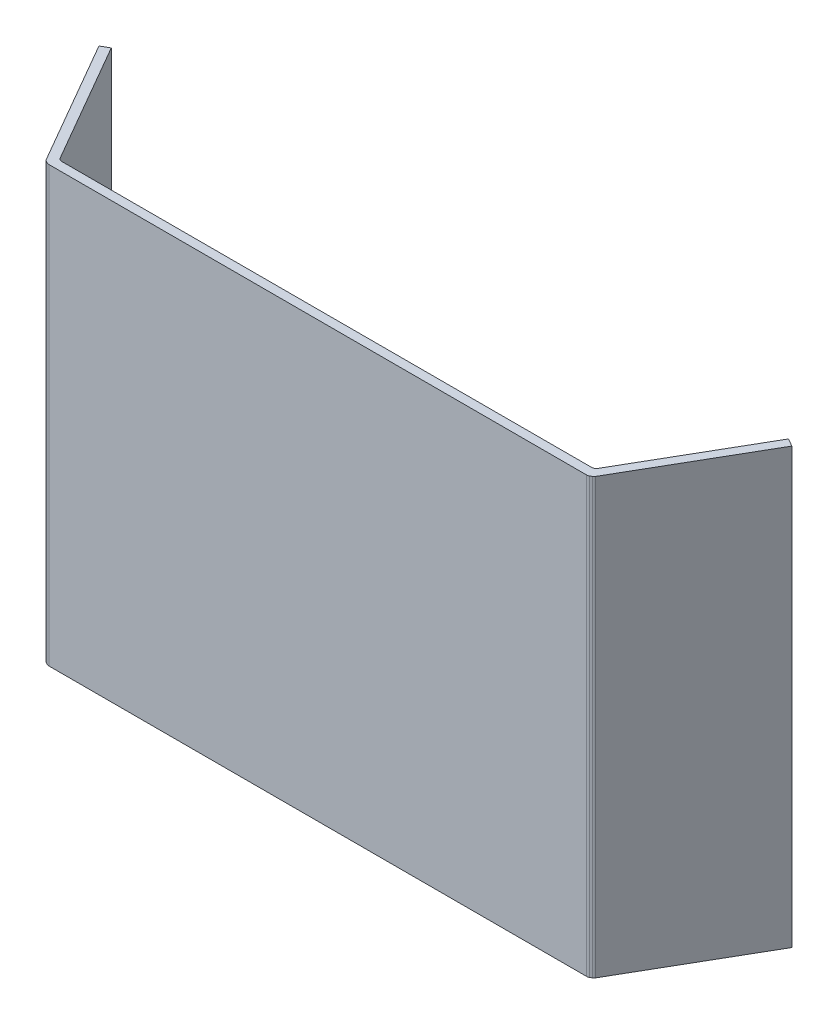
ISO-10303-21;
HEADER;
FILE_DESCRIPTION(('STEP AP214'),'2;1');
FILE_NAME('part.step','',(''),(''),'','','');
FILE_SCHEMA(('AUTOMOTIVE_DESIGN { 1 0 10303 214 1 1 1 1 }'));
ENDSEC;
DATA;
#1=APPLICATION_CONTEXT('core data for automotive mechanical design processes');
#2=APPLICATION_PROTOCOL_DEFINITION('international standard','automotive_design',2000,#1);
#3=PRODUCT_CONTEXT('',#1,'mechanical');
#4=PRODUCT('Part','Part','',(#3));
#5=PRODUCT_RELATED_PRODUCT_CATEGORY('part','',(#4));
#6=PRODUCT_DEFINITION_FORMATION('','',#4);
#7=PRODUCT_DEFINITION_CONTEXT('part definition',#1,'design');
#8=PRODUCT_DEFINITION('design','',#6,#7);
#9=PRODUCT_DEFINITION_SHAPE('','',#8);
#10=(LENGTH_UNIT() NAMED_UNIT(*) SI_UNIT(.MILLI.,.METRE.));
#11=(NAMED_UNIT(*) PLANE_ANGLE_UNIT() SI_UNIT($,.RADIAN.));
#12=(NAMED_UNIT(*) SI_UNIT($,.STERADIAN.) SOLID_ANGLE_UNIT());
#13=UNCERTAINTY_MEASURE_WITH_UNIT(LENGTH_MEASURE(1.E-05),#10,'distance_accuracy_value','');
#14=(GEOMETRIC_REPRESENTATION_CONTEXT(3) GLOBAL_UNCERTAINTY_ASSIGNED_CONTEXT((#13)) GLOBAL_UNIT_ASSIGNED_CONTEXT((#10,
#11,#12)) REPRESENTATION_CONTEXT('',''));
#15=CARTESIAN_POINT('',(0.,0.,0.));
#16=DIRECTION('',(0.,0.,1.));
#17=DIRECTION('',(1.,0.,0.));
#18=AXIS2_PLACEMENT_3D('',#15,#16,#17);
#19=CARTESIAN_POINT('',(94.7975625,152.4,1.5875));
#20=DIRECTION('',(-0.50000000000008,0.,-0.866025403784393));
#21=DIRECTION('',(-0.866025403784393,0.,0.50000000000008));
#22=AXIS2_PLACEMENT_3D('',#19,#20,#21);
#23=PLANE('',#22);
#24=DIRECTION('',(0.866025403784393,0.,-0.50000000000008));
#25=VECTOR('',#24,1.);
#26=CARTESIAN_POINT('',(94.7975625,152.4,1.5875));
#27=LINE('',#26,#25);
#28=CARTESIAN_POINT('',(95.1659431570157,152.4,1.37481532850772));
#29=VERTEX_POINT('',#28);
#30=CARTESIAN_POINT('',(95.8039971714921,152.4,1.00643467149218));
#31=VERTEX_POINT('',#30);
#32=EDGE_CURVE('E156',#29,#31,#27,.T.);
#33=ORIENTED_EDGE('',*,*,#32,.F.);
#34=DIRECTION('',(0.,-1.,0.));
#35=VECTOR('',#34,1.);
#36=CARTESIAN_POINT('',(95.1659431570157,152.4,1.37481532850772));
#37=LINE('',#36,#35);
#38=CARTESIAN_POINT('',(95.1659431570157,0.,1.37481532850772));
#39=VERTEX_POINT('',#38);
#40=EDGE_CURVE('E258',#29,#39,#37,.T.);
#41=ORIENTED_EDGE('',*,*,#40,.T.);
#42=DIRECTION('',(0.866025403784393,0.,-0.50000000000008));
#43=VECTOR('',#42,1.);
#44=CARTESIAN_POINT('',(94.7975625,0.,1.5875));
#45=LINE('',#44,#43);
#46=CARTESIAN_POINT('',(95.8039971714921,0.,1.00643467149218));
#47=VERTEX_POINT('',#46);
#48=EDGE_CURVE('E191',#39,#47,#45,.T.);
#49=ORIENTED_EDGE('',*,*,#48,.T.);
#50=DIRECTION('',(0.,-1.,0.));
#51=VECTOR('',#50,1.);
#52=CARTESIAN_POINT('',(95.8039971714921,152.4,1.00643467149218));
#53=LINE('',#52,#51);
#54=EDGE_CURVE('E256',#47,#31,#53,.F.);
#55=ORIENTED_EDGE('',*,*,#54,.T.);
#56=EDGE_LOOP('',(#33,#41,#49,#55));
#57=FACE_BOUND('',#56,.T.);
#58=ADVANCED_FACE('F33',(#57),#23,.F.);
#59=CARTESIAN_POINT('',(121.572377828508,152.4,-43.2003405122494));
#60=DIRECTION('',(-0.866025403784438,0.,-0.500000000000001));
#61=DIRECTION('',(-0.500000000000001,0.,0.866025403784438));
#62=AXIS2_PLACEMENT_3D('',#59,#60,#61);
#63=PLANE('',#62);
#64=DIRECTION('',(0.500000000000001,0.,-0.866025403784438));
#65=VECTOR('',#64,1.);
#66=CARTESIAN_POINT('',(121.572377828508,152.4,-43.2003405122494));
#67=LINE('',#66,#65);
#68=CARTESIAN_POINT('',(96.3850624999997,152.4,0.425369342984469));
#69=VERTEX_POINT('',#68);
#70=CARTESIAN_POINT('',(121.572377828508,152.4,-43.2003405122494));
#71=VERTEX_POINT('',#70);
#72=EDGE_CURVE('E145',#69,#71,#67,.T.);
#73=ORIENTED_EDGE('',*,*,#72,.F.);
#74=DIRECTION('',(0.,-1.,0.));
#75=VECTOR('',#74,1.);
#76=CARTESIAN_POINT('',(96.3850624999997,152.4,0.425369342984455));
#77=LINE('',#76,#75);
#78=CARTESIAN_POINT('',(96.3850624999997,0.,0.425369342984469));
#79=VERTEX_POINT('',#78);
#80=EDGE_CURVE('E261',#69,#79,#77,.T.);
#81=ORIENTED_EDGE('',*,*,#80,.T.);
#82=DIRECTION('',(0.500000000000001,0.,-0.866025403784438));
#83=VECTOR('',#82,1.);
#84=CARTESIAN_POINT('',(121.572377828508,0.,-43.2003405122494));
#85=LINE('',#84,#83);
#86=CARTESIAN_POINT('',(121.572377828508,0.,-43.2003405122494));
#87=VERTEX_POINT('',#86);
#88=EDGE_CURVE('E162',#79,#87,#85,.T.);
#89=ORIENTED_EDGE('',*,*,#88,.T.);
#90=DIRECTION('',(0.,-1.,0.));
#91=VECTOR('',#90,1.);
#92=CARTESIAN_POINT('',(121.572377828508,152.4,-43.2003405122494));
#93=LINE('',#92,#91);
#94=EDGE_CURVE('E159',#71,#87,#93,.T.);
#95=ORIENTED_EDGE('',*,*,#94,.F.);
#96=EDGE_LOOP('',(#73,#81,#89,#95));
#97=FACE_BOUND('',#96,.T.);
#98=ADVANCED_FACE('F160',(#97),#63,.F.);
#99=CARTESIAN_POINT('',(118.822747171492,152.4,-44.7878405122494));
#100=DIRECTION('',(-0.499999999999999,0.,0.866025403784439));
#101=DIRECTION('',(0.866025403784439,0.,0.499999999999999));
#102=AXIS2_PLACEMENT_3D('',#99,#100,#101);
#103=PLANE('',#102);
#104=DIRECTION('',(-0.866025403784439,0.,-0.499999999999999));
#105=VECTOR('',#104,1.);
#106=CARTESIAN_POINT('',(118.822747171492,0.,-44.7878405122494));
#107=LINE('',#106,#105);
#108=CARTESIAN_POINT('',(118.822747171492,0.,-44.7878405122494));
#109=VERTEX_POINT('',#108);
#110=EDGE_CURVE('E195',#87,#109,#107,.T.);
#111=ORIENTED_EDGE('',*,*,#110,.T.);
#112=DIRECTION('',(0.,-1.,0.));
#113=VECTOR('',#112,1.);
#114=CARTESIAN_POINT('',(118.822747171492,152.4,-44.7878405122494));
#115=LINE('',#114,#113);
#116=CARTESIAN_POINT('',(118.822747171492,152.4,-44.7878405122494));
#117=VERTEX_POINT('',#116);
#118=EDGE_CURVE('E166',#117,#109,#115,.T.);
#119=ORIENTED_EDGE('',*,*,#118,.F.);
#120=DIRECTION('',(-0.866025403784439,0.,-0.499999999999999));
#121=VECTOR('',#120,1.);
#122=CARTESIAN_POINT('',(118.822747171492,152.4,-44.7878405122494));
#123=LINE('',#122,#121);
#124=EDGE_CURVE('E151',#71,#117,#123,.T.);
#125=ORIENTED_EDGE('',*,*,#124,.F.);
#126=ORIENTED_EDGE('',*,*,#94,.T.);
#127=EDGE_LOOP('',(#111,#119,#125,#126));
#128=FACE_BOUND('',#127,.T.);
#129=ADVANCED_FACE('F168',(#128),#103,.F.);
#130=CARTESIAN_POINT('',(118.822747171492,152.4,-44.7878405122494));
#131=DIRECTION('',(0.866025403784441,0.,0.499999999999997));
#132=DIRECTION('',(0.499999999999997,0.,-0.866025403784441));
#133=AXIS2_PLACEMENT_3D('',#130,#131,#132);
#134=PLANE('',#133);
#135=DIRECTION('',(-0.499999999999996,0.,0.866025403784441));
#136=VECTOR('',#135,1.);
#137=CARTESIAN_POINT('',(118.822747171492,0.,-44.7878405122494));
#138=LINE('',#137,#136);
#139=CARTESIAN_POINT('',(94.3392907238308,0.,-2.38124999999988));
#140=VERTEX_POINT('',#139);
#141=EDGE_CURVE('E197',#109,#140,#138,.T.);
#142=ORIENTED_EDGE('',*,*,#141,.T.);
#143=DIRECTION('',(0.,-1.,0.));
#144=VECTOR('',#143,1.);
#145=CARTESIAN_POINT('',(94.3392907238308,152.4,-2.38124999999988));
#146=LINE('',#145,#144);
#147=CARTESIAN_POINT('',(94.3392907238308,152.4,-2.38124999999988));
#148=VERTEX_POINT('',#147);
#149=EDGE_CURVE('E225',#140,#148,#146,.F.);
#150=ORIENTED_EDGE('',*,*,#149,.T.);
#151=DIRECTION('',(-0.499999999999996,0.,0.866025403784441));
#152=VECTOR('',#151,1.);
#153=CARTESIAN_POINT('',(118.822747171492,152.4,-44.7878405122494));
#154=LINE('',#153,#152);
#155=EDGE_CURVE('E171',#117,#148,#154,.T.);
#156=ORIENTED_EDGE('',*,*,#155,.F.);
#157=ORIENTED_EDGE('',*,*,#118,.T.);
#158=EDGE_LOOP('',(#142,#150,#156,#157));
#159=FACE_BOUND('',#158,.T.);
#160=ADVANCED_FACE('F426',(#159),#134,.F.);
#161=CARTESIAN_POINT('',(93.8810189476615,152.4,-1.58749999999988));
#162=DIRECTION('',(0.,0.,1.));
#163=DIRECTION('',(1.,0.,0.));
#164=AXIS2_PLACEMENT_3D('',#161,#162,#163);
#165=PLANE('',#164);
#166=DIRECTION('',(-1.,0.,0.));
#167=VECTOR('',#166,1.);
#168=CARTESIAN_POINT('',(93.8810189476615,152.4,-1.58749999999988));
#169=LINE('',#168,#167);
#170=CARTESIAN_POINT('',(92.9644753953229,152.4,-1.58749999999988));
#171=VERTEX_POINT('',#170);
#172=CARTESIAN_POINT('',(-92.964475395323,152.4,-1.5875));
#173=VERTEX_POINT('',#172);
#174=EDGE_CURVE('E173',#171,#173,#169,.T.);
#175=ORIENTED_EDGE('',*,*,#174,.F.);
#176=DIRECTION('',(0.,-1.,0.));
#177=VECTOR('',#176,1.);
#178=CARTESIAN_POINT('',(92.9644753953229,0.,-1.58749999999988));
#179=LINE('',#178,#177);
#180=CARTESIAN_POINT('',(92.9644753953229,0.,-1.58749999999988));
#181=VERTEX_POINT('',#180);
#182=EDGE_CURVE('E222',#171,#181,#179,.T.);
#183=ORIENTED_EDGE('',*,*,#182,.T.);
#184=DIRECTION('',(-1.,0.,0.));
#185=VECTOR('',#184,1.);
#186=CARTESIAN_POINT('',(93.8810189476615,0.,-1.58749999999988));
#187=LINE('',#186,#185);
#188=CARTESIAN_POINT('',(-92.964475395323,0.,-1.5875));
#189=VERTEX_POINT('',#188);
#190=EDGE_CURVE('E200',#181,#189,#187,.T.);
#191=ORIENTED_EDGE('',*,*,#190,.T.);
#192=DIRECTION('',(0.,-1.,0.));
#193=VECTOR('',#192,1.);
#194=CARTESIAN_POINT('',(-92.964475395323,152.4,-1.5875));
#195=LINE('',#194,#193);
#196=EDGE_CURVE('E165',#189,#173,#195,.F.);
#197=ORIENTED_EDGE('',*,*,#196,.T.);
#198=EDGE_LOOP('',(#175,#183,#191,#197));
#199=FACE_BOUND('',#198,.T.);
#200=ADVANCED_FACE('F277',(#199),#165,.F.);
#201=CARTESIAN_POINT('',(-118.822747171492,152.4,-44.7878405122496));
#202=DIRECTION('',(-0.866025403784442,0.,0.499999999999995));
#203=DIRECTION('',(0.499999999999995,0.,0.866025403784442));
#204=AXIS2_PLACEMENT_3D('',#201,#202,#203);
#205=PLANE('',#204);
#206=DIRECTION('',(-0.499999999999995,0.,-0.866025403784442));
#207=VECTOR('',#206,1.);
#208=CARTESIAN_POINT('',(-118.822747171492,152.4,-44.7878405122496));
#209=LINE('',#208,#207);
#210=CARTESIAN_POINT('',(-94.3392907238308,152.4,-2.38125));
#211=VERTEX_POINT('',#210);
#212=CARTESIAN_POINT('',(-118.822747171492,152.4,-44.7878405122496));
#213=VERTEX_POINT('',#212);
#214=EDGE_CURVE('E179',#211,#213,#209,.T.);
#215=ORIENTED_EDGE('',*,*,#214,.F.);
#216=DIRECTION('',(0.,-1.,0.));
#217=VECTOR('',#216,1.);
#218=CARTESIAN_POINT('',(-94.3392907238308,0.,-2.38125000000001));
#219=LINE('',#218,#217);
#220=CARTESIAN_POINT('',(-94.3392907238308,0.,-2.38125));
#221=VERTEX_POINT('',#220);
#222=EDGE_CURVE('E227',#211,#221,#219,.T.);
#223=ORIENTED_EDGE('',*,*,#222,.T.);
#224=DIRECTION('',(-0.499999999999995,0.,-0.866025403784442));
#225=VECTOR('',#224,1.);
#226=CARTESIAN_POINT('',(-118.822747171492,0.,-44.7878405122496));
#227=LINE('',#226,#225);
#228=CARTESIAN_POINT('',(-118.822747171492,0.,-44.7878405122496));
#229=VERTEX_POINT('',#228);
#230=EDGE_CURVE('E203',#221,#229,#227,.T.);
#231=ORIENTED_EDGE('',*,*,#230,.T.);
#232=DIRECTION('',(0.,-1.,0.));
#233=VECTOR('',#232,1.);
#234=CARTESIAN_POINT('',(-118.822747171492,152.4,-44.7878405122496));
#235=LINE('',#234,#233);
#236=EDGE_CURVE('E217',#213,#229,#235,.T.);
#237=ORIENTED_EDGE('',*,*,#236,.F.);
#238=EDGE_LOOP('',(#215,#223,#231,#237));
#239=FACE_BOUND('',#238,.T.);
#240=ADVANCED_FACE('F284',(#239),#205,.F.);
#241=CARTESIAN_POINT('',(-118.822747171492,152.4,-44.7878405122496));
#242=DIRECTION('',(0.499999999999999,0.,0.866025403784439));
#243=DIRECTION('',(0.866025403784439,0.,-0.499999999999999));
#244=AXIS2_PLACEMENT_3D('',#241,#242,#243);
#245=PLANE('',#244);
#246=DIRECTION('',(-0.866025403784439,0.,0.499999999999999));
#247=VECTOR('',#246,1.);
#248=CARTESIAN_POINT('',(-118.822747171492,0.,-44.7878405122496));
#249=LINE('',#248,#247);
#250=CARTESIAN_POINT('',(-121.572377828508,0.,-43.2003405122496));
#251=VERTEX_POINT('',#250);
#252=EDGE_CURVE('E205',#229,#251,#249,.T.);
#253=ORIENTED_EDGE('',*,*,#252,.T.);
#254=DIRECTION('',(0.,-1.,0.));
#255=VECTOR('',#254,1.);
#256=CARTESIAN_POINT('',(-121.572377828508,152.4,-43.2003405122496));
#257=LINE('',#256,#255);
#258=CARTESIAN_POINT('',(-121.572377828508,152.4,-43.2003405122496));
#259=VERTEX_POINT('',#258);
#260=EDGE_CURVE('E190',#259,#251,#257,.T.);
#261=ORIENTED_EDGE('',*,*,#260,.F.);
#262=DIRECTION('',(-0.866025403784439,0.,0.499999999999999));
#263=VECTOR('',#262,1.);
#264=CARTESIAN_POINT('',(-118.822747171492,152.4,-44.7878405122496));
#265=LINE('',#264,#263);
#266=EDGE_CURVE('E181',#213,#259,#265,.T.);
#267=ORIENTED_EDGE('',*,*,#266,.F.);
#268=ORIENTED_EDGE('',*,*,#236,.T.);
#269=EDGE_LOOP('',(#253,#261,#267,#268));
#270=FACE_BOUND('',#269,.T.);
#271=ADVANCED_FACE('F288',(#270),#245,.F.);
#272=CARTESIAN_POINT('',(-121.572377828508,152.4,-43.2003405122496));
#273=DIRECTION('',(0.866025403784439,0.,-0.5));
#274=DIRECTION('',(-0.5,0.,-0.866025403784439));
#275=AXIS2_PLACEMENT_3D('',#272,#273,#274);
#276=PLANE('',#275);
#277=DIRECTION('',(0.5,0.,0.866025403784439));
#278=VECTOR('',#277,1.);
#279=CARTESIAN_POINT('',(-121.572377828508,0.,-43.2003405122496));
#280=LINE('',#279,#278);
#281=CARTESIAN_POINT('',(-96.3850624999998,0.,0.425369342984372));
#282=VERTEX_POINT('',#281);
#283=EDGE_CURVE('E207',#251,#282,#280,.T.);
#284=ORIENTED_EDGE('',*,*,#283,.T.);
#285=DIRECTION('',(0.,-1.,0.));
#286=VECTOR('',#285,1.);
#287=CARTESIAN_POINT('',(-96.3850624999998,152.4,0.425369342984372));
#288=LINE('',#287,#286);
#289=CARTESIAN_POINT('',(-96.3850624999998,152.4,0.425369342984372));
#290=VERTEX_POINT('',#289);
#291=EDGE_CURVE('E48',#282,#290,#288,.F.);
#292=ORIENTED_EDGE('',*,*,#291,.T.);
#293=DIRECTION('',(0.5,0.,0.866025403784439));
#294=VECTOR('',#293,1.);
#295=CARTESIAN_POINT('',(-121.572377828508,152.4,-43.2003405122496));
#296=LINE('',#295,#294);
#297=EDGE_CURVE('E183',#259,#290,#296,.T.);
#298=ORIENTED_EDGE('',*,*,#297,.F.);
#299=ORIENTED_EDGE('',*,*,#260,.T.);
#300=EDGE_LOOP('',(#284,#292,#298,#299));
#301=FACE_BOUND('',#300,.T.);
#302=ADVANCED_FACE('F396',(#301),#276,.F.);
#303=CARTESIAN_POINT('',(-94.7975625000001,152.4,1.5875));
#304=DIRECTION('',(0.500000000000134,0.,-0.866025403784362));
#305=DIRECTION('',(-0.866025403784361,0.,-0.500000000000134));
#306=AXIS2_PLACEMENT_3D('',#303,#304,#305);
#307=PLANE('',#306);
#308=DIRECTION('',(0.866025403784361,0.,0.500000000000134));
#309=VECTOR('',#308,1.);
#310=CARTESIAN_POINT('',(-94.7975625000001,0.,1.5875));
#311=LINE('',#310,#309);
#312=CARTESIAN_POINT('',(-95.8039971714922,0.,1.00643467149204));
#313=VERTEX_POINT('',#312);
#314=CARTESIAN_POINT('',(-95.1659431570158,0.,1.37481532850766));
#315=VERTEX_POINT('',#314);
#316=EDGE_CURVE('E209',#313,#315,#311,.T.);
#317=ORIENTED_EDGE('',*,*,#316,.T.);
#318=DIRECTION('',(0.,-1.,0.));
#319=VECTOR('',#318,1.);
#320=CARTESIAN_POINT('',(-95.1659431570158,152.4,1.37481532850766));
#321=LINE('',#320,#319);
#322=CARTESIAN_POINT('',(-95.1659431570158,152.4,1.37481532850766));
#323=VERTEX_POINT('',#322);
#324=EDGE_CURVE('E246',#315,#323,#321,.F.);
#325=ORIENTED_EDGE('',*,*,#324,.T.);
#326=DIRECTION('',(0.866025403784361,0.,0.500000000000134));
#327=VECTOR('',#326,1.);
#328=CARTESIAN_POINT('',(-94.7975625000001,152.4,1.5875));
#329=LINE('',#328,#327);
#330=CARTESIAN_POINT('',(-95.8039971714922,152.4,1.00643467149204));
#331=VERTEX_POINT('',#330);
#332=EDGE_CURVE('E185',#331,#323,#329,.T.);
#333=ORIENTED_EDGE('',*,*,#332,.F.);
#334=DIRECTION('',(0.,-1.,0.));
#335=VECTOR('',#334,1.);
#336=CARTESIAN_POINT('',(-95.8039971714922,152.4,1.00643467149204));
#337=LINE('',#336,#335);
#338=EDGE_CURVE('E243',#331,#313,#337,.T.);
#339=ORIENTED_EDGE('',*,*,#338,.T.);
#340=EDGE_LOOP('',(#317,#325,#333,#339));
#341=FACE_BOUND('',#340,.T.);
#342=ADVANCED_FACE('F296',(#341),#307,.F.);
#343=CARTESIAN_POINT('',(94.7975625,152.4,1.5875));
#344=DIRECTION('',(0.,0.,-1.));
#345=DIRECTION('',(-1.,0.,0.));
#346=AXIS2_PLACEMENT_3D('',#343,#344,#345);
#347=PLANE('',#346);
#348=DIRECTION('',(1.,0.,0.));
#349=VECTOR('',#348,1.);
#350=CARTESIAN_POINT('',(94.7975625,152.4,1.5875));
#351=LINE('',#350,#349);
#352=CARTESIAN_POINT('',(-94.3721931570156,152.4,1.5875));
#353=VERTEX_POINT('',#352);
#354=CARTESIAN_POINT('',(94.3721931570156,152.4,1.5875));
#355=VERTEX_POINT('',#354);
#356=EDGE_CURVE('E187',#353,#355,#351,.T.);
#357=ORIENTED_EDGE('',*,*,#356,.F.);
#358=DIRECTION('',(0.,-1.,0.));
#359=VECTOR('',#358,1.);
#360=CARTESIAN_POINT('',(-94.3721931570156,152.4,1.5875));
#361=LINE('',#360,#359);
#362=CARTESIAN_POINT('',(-94.3721931570156,0.,1.5875));
#363=VERTEX_POINT('',#362);
#364=EDGE_CURVE('E232',#353,#363,#361,.T.);
#365=ORIENTED_EDGE('',*,*,#364,.T.);
#366=DIRECTION('',(1.,0.,0.));
#367=VECTOR('',#366,1.);
#368=CARTESIAN_POINT('',(94.7975625,0.,1.5875));
#369=LINE('',#368,#367);
#370=CARTESIAN_POINT('',(94.3721931570156,0.,1.5875));
#371=VERTEX_POINT('',#370);
#372=EDGE_CURVE('E212',#363,#371,#369,.T.);
#373=ORIENTED_EDGE('',*,*,#372,.T.);
#374=DIRECTION('',(0.,-1.,0.));
#375=VECTOR('',#374,1.);
#376=CARTESIAN_POINT('',(94.3721931570156,152.4,1.5875));
#377=LINE('',#376,#375);
#378=EDGE_CURVE('E230',#371,#355,#377,.F.);
#379=ORIENTED_EDGE('',*,*,#378,.T.);
#380=EDGE_LOOP('',(#357,#365,#373,#379));
#381=FACE_BOUND('',#380,.T.);
#382=ADVANCED_FACE('F305',(#381),#347,.F.);
#383=CARTESIAN_POINT('',(0.,152.4,0.));
#384=DIRECTION('',(0.,-1.,0.));
#385=DIRECTION('',(0.,0.,-1.));
#386=AXIS2_PLACEMENT_3D('',#383,#384,#385);
#387=PLANE('',#386);
#388=ORIENTED_EDGE('',*,*,#332,.T.);
#389=CARTESIAN_POINT('',(-94.3721931570156,152.4,0.));
#390=DIRECTION('',(0.,-1.,0.));
#391=DIRECTION('',(0.,0.,-1.));
#392=AXIS2_PLACEMENT_3D('',#389,#390,#391);
#393=CIRCLE('',#392,1.5875);
#394=EDGE_CURVE('E253',#323,#353,#393,.F.);
#395=ORIENTED_EDGE('',*,*,#394,.T.);
#396=ORIENTED_EDGE('',*,*,#356,.T.);
#397=CARTESIAN_POINT('',(94.3721931570156,152.4,0.));
#398=DIRECTION('',(0.,-1.,0.));
#399=DIRECTION('',(0.,0.,-1.));
#400=AXIS2_PLACEMENT_3D('',#397,#398,#399);
#401=CIRCLE('',#400,1.5875);
#402=EDGE_CURVE('E249',#355,#29,#401,.F.);
#403=ORIENTED_EDGE('',*,*,#402,.T.);
#404=ORIENTED_EDGE('',*,*,#32,.T.);
#405=CARTESIAN_POINT('',(95.010247171492,152.4,-0.368380657015534));
#406=DIRECTION('',(0.,-1.,0.));
#407=DIRECTION('',(0.,0.,-1.));
#408=AXIS2_PLACEMENT_3D('',#405,#406,#407);
#409=CIRCLE('',#408,1.5875);
#410=EDGE_CURVE('E56',#31,#69,#409,.F.);
#411=ORIENTED_EDGE('',*,*,#410,.T.);
#412=ORIENTED_EDGE('',*,*,#72,.T.);
#413=ORIENTED_EDGE('',*,*,#124,.T.);
#414=ORIENTED_EDGE('',*,*,#155,.T.);
#415=CARTESIAN_POINT('',(92.9644753953229,152.4,-3.17499999999988));
#416=DIRECTION('',(0.,-1.,0.));
#417=DIRECTION('',(0.,0.,-1.));
#418=AXIS2_PLACEMENT_3D('',#415,#416,#417);
#419=CIRCLE('',#418,1.5875);
#420=EDGE_CURVE('E265',#148,#171,#419,.T.);
#421=ORIENTED_EDGE('',*,*,#420,.T.);
#422=ORIENTED_EDGE('',*,*,#174,.T.);
#423=CARTESIAN_POINT('',(-92.964475395323,152.4,-3.175));
#424=DIRECTION('',(0.,-1.,0.));
#425=DIRECTION('',(0.,0.,-1.));
#426=AXIS2_PLACEMENT_3D('',#423,#424,#425);
#427=CIRCLE('',#426,1.5875);
#428=EDGE_CURVE('E11',#173,#211,#427,.T.);
#429=ORIENTED_EDGE('',*,*,#428,.T.);
#430=ORIENTED_EDGE('',*,*,#214,.T.);
#431=ORIENTED_EDGE('',*,*,#266,.T.);
#432=ORIENTED_EDGE('',*,*,#297,.T.);
#433=CARTESIAN_POINT('',(-95.010247171492,152.4,-0.368380657015633));
#434=DIRECTION('',(0.,-1.,0.));
#435=DIRECTION('',(0.,0.,-1.));
#436=AXIS2_PLACEMENT_3D('',#433,#434,#435);
#437=CIRCLE('',#436,1.5875);
#438=EDGE_CURVE('E251',#290,#331,#437,.F.);
#439=ORIENTED_EDGE('',*,*,#438,.T.);
#440=EDGE_LOOP('',(#388,#395,#396,#403,#404,#411,#412,#413,#414,#421,#422,#429,#430,#431,#432,#439));
#441=FACE_BOUND('',#440,.T.);
#442=ADVANCED_FACE('F148',(#441),#387,.F.);
#443=CARTESIAN_POINT('',(0.,0.,0.));
#444=DIRECTION('',(0.,-1.,0.));
#445=DIRECTION('',(0.,0.,-1.));
#446=AXIS2_PLACEMENT_3D('',#443,#444,#445);
#447=PLANE('',#446);
#448=ORIENTED_EDGE('',*,*,#372,.F.);
#449=CARTESIAN_POINT('',(-94.3721931570156,0.,0.));
#450=DIRECTION('',(0.,-1.,0.));
#451=DIRECTION('',(0.,0.,-1.));
#452=AXIS2_PLACEMENT_3D('',#449,#450,#451);
#453=CIRCLE('',#452,1.5875);
#454=EDGE_CURVE('E241',#363,#315,#453,.T.);
#455=ORIENTED_EDGE('',*,*,#454,.T.);
#456=ORIENTED_EDGE('',*,*,#316,.F.);
#457=CARTESIAN_POINT('',(-95.010247171492,0.,-0.368380657015633));
#458=DIRECTION('',(0.,-1.,0.));
#459=DIRECTION('',(0.,0.,-1.));
#460=AXIS2_PLACEMENT_3D('',#457,#458,#459);
#461=CIRCLE('',#460,1.5875);
#462=EDGE_CURVE('E239',#313,#282,#461,.T.);
#463=ORIENTED_EDGE('',*,*,#462,.T.);
#464=ORIENTED_EDGE('',*,*,#283,.F.);
#465=ORIENTED_EDGE('',*,*,#252,.F.);
#466=ORIENTED_EDGE('',*,*,#230,.F.);
#467=CARTESIAN_POINT('',(-92.964475395323,0.,-3.175));
#468=DIRECTION('',(0.,-1.,0.));
#469=DIRECTION('',(0.,0.,-1.));
#470=AXIS2_PLACEMENT_3D('',#467,#468,#469);
#471=CIRCLE('',#470,1.5875);
#472=EDGE_CURVE('E41',#221,#189,#471,.F.);
#473=ORIENTED_EDGE('',*,*,#472,.T.);
#474=ORIENTED_EDGE('',*,*,#190,.F.);
#475=CARTESIAN_POINT('',(92.9644753953229,0.,-3.17499999999988));
#476=DIRECTION('',(0.,-1.,0.));
#477=DIRECTION('',(0.,0.,-1.));
#478=AXIS2_PLACEMENT_3D('',#475,#476,#477);
#479=CIRCLE('',#478,1.5875);
#480=EDGE_CURVE('E263',#181,#140,#479,.F.);
#481=ORIENTED_EDGE('',*,*,#480,.T.);
#482=ORIENTED_EDGE('',*,*,#141,.F.);
#483=ORIENTED_EDGE('',*,*,#110,.F.);
#484=ORIENTED_EDGE('',*,*,#88,.F.);
#485=CARTESIAN_POINT('',(95.010247171492,0.,-0.368380657015534));
#486=DIRECTION('',(0.,-1.,0.));
#487=DIRECTION('',(0.,0.,-1.));
#488=AXIS2_PLACEMENT_3D('',#485,#486,#487);
#489=CIRCLE('',#488,1.5875);
#490=EDGE_CURVE('E235',#79,#47,#489,.T.);
#491=ORIENTED_EDGE('',*,*,#490,.T.);
#492=ORIENTED_EDGE('',*,*,#48,.F.);
#493=CARTESIAN_POINT('',(94.3721931570156,0.,0.));
#494=DIRECTION('',(0.,-1.,0.));
#495=DIRECTION('',(0.,0.,-1.));
#496=AXIS2_PLACEMENT_3D('',#493,#494,#495);
#497=CIRCLE('',#496,1.5875);
#498=EDGE_CURVE('E237',#39,#371,#497,.T.);
#499=ORIENTED_EDGE('',*,*,#498,.T.);
#500=EDGE_LOOP('',(#448,#455,#456,#463,#464,#465,#466,#473,#474,#481,#482,#483,#484,#491,#492,#499));
#501=FACE_BOUND('',#500,.T.);
#502=ADVANCED_FACE('F270',(#501),#447,.T.);
#503=CARTESIAN_POINT('',(92.9644753953229,152.4,-3.17499999999988));
#504=DIRECTION('',(0.,1.,0.));
#505=DIRECTION('',(0.,0.,1.));
#506=AXIS2_PLACEMENT_3D('',#503,#504,#505);
#507=CYLINDRICAL_SURFACE('',#506,1.5875);
#508=ORIENTED_EDGE('',*,*,#420,.F.);
#509=ORIENTED_EDGE('',*,*,#149,.F.);
#510=ORIENTED_EDGE('',*,*,#480,.F.);
#511=ORIENTED_EDGE('',*,*,#182,.F.);
#512=EDGE_LOOP('',(#508,#509,#510,#511));
#513=FACE_BOUND('',#512,.T.);
#514=ADVANCED_FACE('F328',(#513),#507,.F.);
#515=CARTESIAN_POINT('',(-92.964475395323,152.4,-3.175));
#516=DIRECTION('',(0.,1.,0.));
#517=DIRECTION('',(0.,0.,1.));
#518=AXIS2_PLACEMENT_3D('',#515,#516,#517);
#519=CYLINDRICAL_SURFACE('',#518,1.5875);
#520=ORIENTED_EDGE('',*,*,#428,.F.);
#521=ORIENTED_EDGE('',*,*,#196,.F.);
#522=ORIENTED_EDGE('',*,*,#472,.F.);
#523=ORIENTED_EDGE('',*,*,#222,.F.);
#524=EDGE_LOOP('',(#520,#521,#522,#523));
#525=FACE_BOUND('',#524,.T.);
#526=ADVANCED_FACE('F280',(#525),#519,.F.);
#527=CARTESIAN_POINT('',(-94.3721931570156,152.4,0.));
#528=DIRECTION('',(0.,-1.,0.));
#529=DIRECTION('',(0.,0.,-1.));
#530=AXIS2_PLACEMENT_3D('',#527,#528,#529);
#531=CYLINDRICAL_SURFACE('',#530,1.5875);
#532=ORIENTED_EDGE('',*,*,#394,.F.);
#533=ORIENTED_EDGE('',*,*,#324,.F.);
#534=ORIENTED_EDGE('',*,*,#454,.F.);
#535=ORIENTED_EDGE('',*,*,#364,.F.);
#536=EDGE_LOOP('',(#532,#533,#534,#535));
#537=FACE_BOUND('',#536,.T.);
#538=ADVANCED_FACE('F302',(#537),#531,.T.);
#539=CARTESIAN_POINT('',(-95.010247171492,152.4,-0.368380657015633));
#540=DIRECTION('',(0.,-1.,0.));
#541=DIRECTION('',(0.,0.,-1.));
#542=AXIS2_PLACEMENT_3D('',#539,#540,#541);
#543=CYLINDRICAL_SURFACE('',#542,1.5875);
#544=ORIENTED_EDGE('',*,*,#438,.F.);
#545=ORIENTED_EDGE('',*,*,#291,.F.);
#546=ORIENTED_EDGE('',*,*,#462,.F.);
#547=ORIENTED_EDGE('',*,*,#338,.F.);
#548=EDGE_LOOP('',(#544,#545,#546,#547));
#549=FACE_BOUND('',#548,.T.);
#550=ADVANCED_FACE('F293',(#549),#543,.T.);
#551=CARTESIAN_POINT('',(94.3721931570156,152.4,0.));
#552=DIRECTION('',(0.,-1.,0.));
#553=DIRECTION('',(0.,0.,-1.));
#554=AXIS2_PLACEMENT_3D('',#551,#552,#553);
#555=CYLINDRICAL_SURFACE('',#554,1.5875);
#556=ORIENTED_EDGE('',*,*,#402,.F.);
#557=ORIENTED_EDGE('',*,*,#378,.F.);
#558=ORIENTED_EDGE('',*,*,#498,.F.);
#559=ORIENTED_EDGE('',*,*,#40,.F.);
#560=EDGE_LOOP('',(#556,#557,#558,#559));
#561=FACE_BOUND('',#560,.T.);
#562=ADVANCED_FACE('F311',(#561),#555,.T.);
#563=CARTESIAN_POINT('',(95.010247171492,152.4,-0.368380657015534));
#564=DIRECTION('',(0.,-1.,0.));
#565=DIRECTION('',(0.,0.,-1.));
#566=AXIS2_PLACEMENT_3D('',#563,#564,#565);
#567=CYLINDRICAL_SURFACE('',#566,1.5875);
#568=ORIENTED_EDGE('',*,*,#410,.F.);
#569=ORIENTED_EDGE('',*,*,#54,.F.);
#570=ORIENTED_EDGE('',*,*,#490,.F.);
#571=ORIENTED_EDGE('',*,*,#80,.F.);
#572=EDGE_LOOP('',(#568,#569,#570,#571));
#573=FACE_BOUND('',#572,.T.);
#574=ADVANCED_FACE('F35',(#573),#567,.T.);
#575=CLOSED_SHELL('',(#58,#98,#129,#160,#200,#240,#271,#302,#342,#382,#442,#502,#514,#526,#538,
#550,#562,#574));
#576=MANIFOLD_SOLID_BREP('B2',#575);
#577=ADVANCED_BREP_SHAPE_REPRESENTATION('',(#18,#576),#14);
#578=SHAPE_DEFINITION_REPRESENTATION(#9,#577);
ENDSEC;
END-ISO-10303-21;
